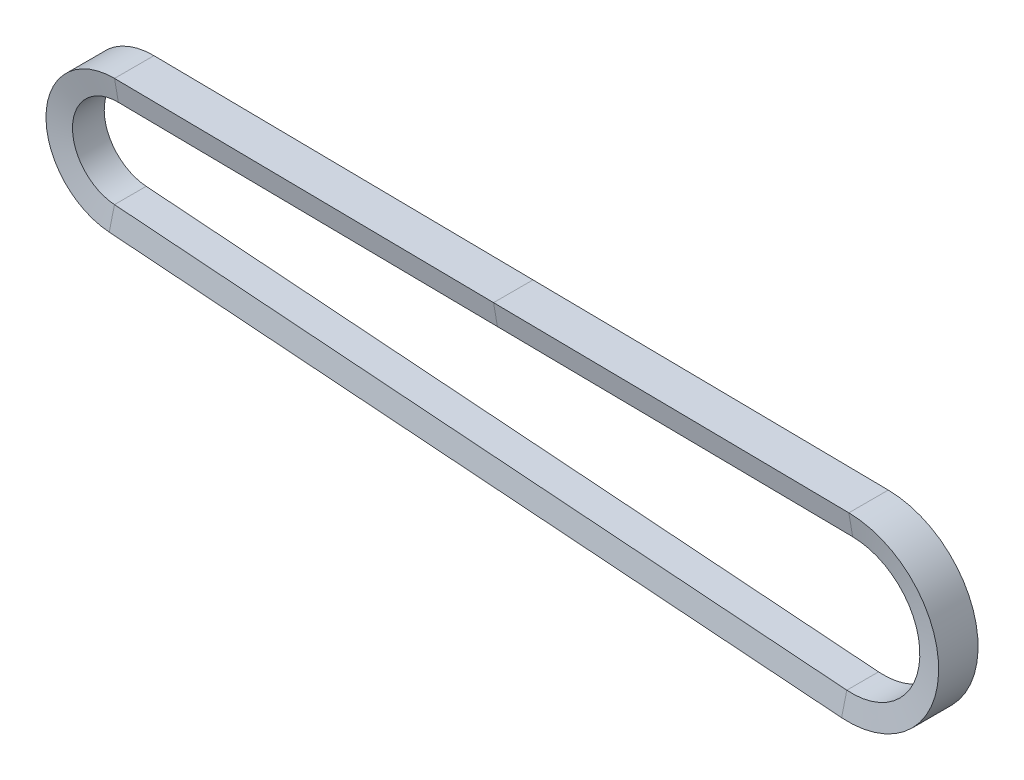
ISO-10303-21;
HEADER;
FILE_DESCRIPTION(('STEP AP214'),'2;1');
FILE_NAME('part.step','',(''),(''),'','','');
FILE_SCHEMA(('AUTOMOTIVE_DESIGN { 1 0 10303 214 1 1 1 1 }'));
ENDSEC;
DATA;
#1=APPLICATION_CONTEXT('core data for automotive mechanical design processes');
#2=APPLICATION_PROTOCOL_DEFINITION('international standard','automotive_design',2000,#1);
#3=PRODUCT_CONTEXT('',#1,'mechanical');
#4=PRODUCT('Part','Part','',(#3));
#5=PRODUCT_RELATED_PRODUCT_CATEGORY('part','',(#4));
#6=PRODUCT_DEFINITION_FORMATION('','',#4);
#7=PRODUCT_DEFINITION_CONTEXT('part definition',#1,'design');
#8=PRODUCT_DEFINITION('design','',#6,#7);
#9=PRODUCT_DEFINITION_SHAPE('','',#8);
#10=(LENGTH_UNIT() NAMED_UNIT(*) SI_UNIT(.MILLI.,.METRE.));
#11=(NAMED_UNIT(*) PLANE_ANGLE_UNIT() SI_UNIT($,.RADIAN.));
#12=(NAMED_UNIT(*) SI_UNIT($,.STERADIAN.) SOLID_ANGLE_UNIT());
#13=UNCERTAINTY_MEASURE_WITH_UNIT(LENGTH_MEASURE(1.E-05),#10,'distance_accuracy_value','');
#14=(GEOMETRIC_REPRESENTATION_CONTEXT(3) GLOBAL_UNCERTAINTY_ASSIGNED_CONTEXT((#13)) GLOBAL_UNIT_ASSIGNED_CONTEXT((#10,
#11,#12)) REPRESENTATION_CONTEXT('',''));
#15=CARTESIAN_POINT('',(0.,0.,0.));
#16=DIRECTION('',(0.,0.,1.));
#17=DIRECTION('',(1.,0.,0.));
#18=AXIS2_PLACEMENT_3D('',#15,#16,#17);
#19=CARTESIAN_POINT('',(78.374582485767,19.1376937923296,4.34770366555069));
#20=DIRECTION('',(0.00206408883546674,0.167155034399031,-0.98592846292839));
#21=DIRECTION('',(0.,0.985930563190832,0.167155390479065));
#22=AXIS2_PLACEMENT_3D('',#19,#20,#21);
#23=PLANE('',#22);
#24=DIRECTION('',(0.,-0.985930563190832,-0.167155390479065));
#25=VECTOR('',#24,1.);
#26=CARTESIAN_POINT('',(78.3745824857669,19.1376937923296,4.34770366555069));
#27=LINE('',#26,#25);
#28=CARTESIAN_POINT('',(78.3745824857669,19.1376937923296,4.34770366555069));
#29=VERTEX_POINT('',#28);
#30=CARTESIAN_POINT('',(78.3745824857669,14.1376937923296,3.5));
#31=VERTEX_POINT('',#30);
#32=EDGE_CURVE('E171',#29,#31,#27,.T.);
#33=ORIENTED_EDGE('',*,*,#32,.F.);
#34=DIRECTION('',(-0.999923767846515,0.0123474084579639,0.));
#35=VECTOR('',#34,1.);
#36=CARTESIAN_POINT('',(78.374582485767,19.1376937923296,4.34770366555069));
#37=LINE('',#36,#35);
#38=CARTESIAN_POINT('',(0.,20.1054905522349,4.34770366555069));
#39=VERTEX_POINT('',#38);
#40=EDGE_CURVE('E170',#29,#39,#37,.T.);
#41=ORIENTED_EDGE('',*,*,#40,.T.);
#42=DIRECTION('',(0.,-0.985930563190832,-0.167155390479065));
#43=VECTOR('',#42,1.);
#44=CARTESIAN_POINT('',(0.,20.1054905522349,4.34770366555069));
#45=LINE('',#44,#43);
#46=CARTESIAN_POINT('',(0.,15.1054905522349,3.5));
#47=VERTEX_POINT('',#46);
#48=EDGE_CURVE('E145',#39,#47,#45,.T.);
#49=ORIENTED_EDGE('',*,*,#48,.T.);
#50=DIRECTION('',(-0.999923767846515,0.0123474084579639,0.));
#51=VECTOR('',#50,1.);
#52=CARTESIAN_POINT('',(78.374582485767,14.1376937923296,3.5));
#53=LINE('',#52,#51);
#54=EDGE_CURVE('E175',#31,#47,#53,.T.);
#55=ORIENTED_EDGE('',*,*,#54,.F.);
#56=EDGE_LOOP('',(#33,#41,#49,#55));
#57=FACE_BOUND('',#56,.T.);
#58=ADVANCED_FACE('F37',(#57),#23,.F.);
#59=CARTESIAN_POINT('',(0.,20.1054905522349,4.34770366555069));
#60=DIRECTION('',(0.00206408883546674,0.167155034399031,-0.98592846292839));
#61=DIRECTION('',(0.,0.985930563190832,0.167155390479065));
#62=AXIS2_PLACEMENT_3D('',#59,#60,#61);
#63=PLANE('',#62);
#64=DIRECTION('',(-0.999923767846515,0.0123474084579639,0.));
#65=VECTOR('',#64,1.);
#66=CARTESIAN_POINT('',(0.,15.1054905522349,3.5));
#67=LINE('',#66,#65);
#68=CARTESIAN_POINT('',(-83.6212463728452,16.138074953097,3.5));
#69=VERTEX_POINT('',#68);
#70=EDGE_CURVE('E151',#47,#69,#67,.T.);
#71=ORIENTED_EDGE('',*,*,#70,.F.);
#72=ORIENTED_EDGE('',*,*,#48,.F.);
#73=DIRECTION('',(-0.999923767846515,0.0123474084579639,0.));
#74=VECTOR('',#73,1.);
#75=CARTESIAN_POINT('',(0.,20.1054905522349,4.34770366555069));
#76=LINE('',#75,#74);
#77=CARTESIAN_POINT('',(-83.6212463728452,21.138074953097,4.34770366555069));
#78=VERTEX_POINT('',#77);
#79=EDGE_CURVE('E149',#39,#78,#76,.T.);
#80=ORIENTED_EDGE('',*,*,#79,.T.);
#81=DIRECTION('',(0.,-0.985930563190832,-0.167155390479065));
#82=VECTOR('',#81,1.);
#83=CARTESIAN_POINT('',(-83.6212463728452,21.138074953097,4.34770366555069));
#84=LINE('',#83,#82);
#85=EDGE_CURVE('E167',#78,#69,#84,.T.);
#86=ORIENTED_EDGE('',*,*,#85,.T.);
#87=EDGE_LOOP('',(#71,#72,#80,#86));
#88=FACE_BOUND('',#87,.T.);
#89=ADVANCED_FACE('F147',(#88),#63,.F.);
#90=CARTESIAN_POINT('',(0.,15.1054905522349,3.5));
#91=DIRECTION('',(0.0123474084579639,0.999923767846515,0.));
#92=DIRECTION('',(-0.999923767846516,0.0123474084579639,0.));
#93=AXIS2_PLACEMENT_3D('',#90,#91,#92);
#94=PLANE('',#93);
#95=DIRECTION('',(-0.999923767846515,0.0123474084579639,0.));
#96=VECTOR('',#95,1.);
#97=CARTESIAN_POINT('',(0.,15.1054905522349,-3.5));
#98=LINE('',#97,#96);
#99=CARTESIAN_POINT('',(0.,15.1054905522349,-3.5));
#100=VERTEX_POINT('',#99);
#101=CARTESIAN_POINT('',(-83.6212463728452,16.138074953097,-3.5));
#102=VERTEX_POINT('',#101);
#103=EDGE_CURVE('E216',#100,#102,#98,.T.);
#104=ORIENTED_EDGE('',*,*,#103,.F.);
#105=DIRECTION('',(0.,0.,-1.));
#106=VECTOR('',#105,1.);
#107=CARTESIAN_POINT('',(0.,15.1054905522349,3.5));
#108=LINE('',#107,#106);
#109=EDGE_CURVE('E156',#47,#100,#108,.T.);
#110=ORIENTED_EDGE('',*,*,#109,.F.);
#111=ORIENTED_EDGE('',*,*,#70,.T.);
#112=DIRECTION('',(0.,0.,-1.));
#113=VECTOR('',#112,1.);
#114=CARTESIAN_POINT('',(-83.6212463728452,16.138074953097,3.5));
#115=LINE('',#114,#113);
#116=EDGE_CURVE('E241',#69,#102,#115,.T.);
#117=ORIENTED_EDGE('',*,*,#116,.T.);
#118=EDGE_LOOP('',(#104,#110,#111,#117));
#119=FACE_BOUND('',#118,.T.);
#120=ADVANCED_FACE('F261',(#119),#94,.F.);
#121=CARTESIAN_POINT('',(0.,15.1054905522349,-3.5));
#122=DIRECTION('',(0.00206408883546674,0.167155034399031,0.98592846292839));
#123=DIRECTION('',(0.,-0.985930563190832,0.167155390479065));
#124=AXIS2_PLACEMENT_3D('',#121,#122,#123);
#125=PLANE('',#124);
#126=DIRECTION('',(-0.999923767846515,0.0123474084579639,0.));
#127=VECTOR('',#126,1.);
#128=CARTESIAN_POINT('',(0.,20.1054905522349,-4.34770366555069));
#129=LINE('',#128,#127);
#130=CARTESIAN_POINT('',(0.,20.1054905522349,-4.34770366555069));
#131=VERTEX_POINT('',#130);
#132=CARTESIAN_POINT('',(-83.6212463728452,21.138074953097,-4.34770366555069));
#133=VERTEX_POINT('',#132);
#134=EDGE_CURVE('E186',#131,#133,#129,.T.);
#135=ORIENTED_EDGE('',*,*,#134,.F.);
#136=DIRECTION('',(0.,0.985930563190832,-0.167155390479065));
#137=VECTOR('',#136,1.);
#138=CARTESIAN_POINT('',(0.,15.1054905522349,-3.5));
#139=LINE('',#138,#137);
#140=EDGE_CURVE('E178',#100,#131,#139,.T.);
#141=ORIENTED_EDGE('',*,*,#140,.F.);
#142=ORIENTED_EDGE('',*,*,#103,.T.);
#143=DIRECTION('',(0.,0.985930563190832,-0.167155390479065));
#144=VECTOR('',#143,1.);
#145=CARTESIAN_POINT('',(-83.6212463728452,16.138074953097,-3.5));
#146=LINE('',#145,#144);
#147=EDGE_CURVE('E218',#102,#133,#146,.T.);
#148=ORIENTED_EDGE('',*,*,#147,.T.);
#149=EDGE_LOOP('',(#135,#141,#142,#148));
#150=FACE_BOUND('',#149,.T.);
#151=ADVANCED_FACE('F214',(#150),#125,.F.);
#152=CARTESIAN_POINT('',(0.,20.1054905522349,4.34770366555069));
#153=DIRECTION('',(-0.0123474084579639,-0.999923767846515,0.));
#154=DIRECTION('',(0.999923767846515,-0.0123474084579639,0.));
#155=AXIS2_PLACEMENT_3D('',#152,#153,#154);
#156=PLANE('',#155);
#157=DIRECTION('',(0.,0.,1.));
#158=VECTOR('',#157,1.);
#159=CARTESIAN_POINT('',(-83.6212463728452,21.138074953097,4.34770366555069));
#160=LINE('',#159,#158);
#161=EDGE_CURVE('E165',#133,#78,#160,.T.);
#162=ORIENTED_EDGE('',*,*,#161,.T.);
#163=ORIENTED_EDGE('',*,*,#79,.F.);
#164=DIRECTION('',(0.,0.,1.));
#165=VECTOR('',#164,1.);
#166=CARTESIAN_POINT('',(0.,20.1054905522349,4.34770366555069));
#167=LINE('',#166,#165);
#168=EDGE_CURVE('E163',#131,#39,#167,.T.);
#169=ORIENTED_EDGE('',*,*,#168,.F.);
#170=ORIENTED_EDGE('',*,*,#134,.T.);
#171=EDGE_LOOP('',(#162,#163,#169,#170));
#172=FACE_BOUND('',#171,.T.);
#173=ADVANCED_FACE('F161',(#172),#156,.F.);
#174=CARTESIAN_POINT('',(-83.6212463728452,21.138074953097,4.34770366555069));
#175=CARTESIAN_POINT('',(-111.863042033429,21.3705620928323,4.34770366555069));
#176=CARTESIAN_POINT('',(-112.966620071375,-6.85062122605928,4.34770366555069));
#177=CARTESIAN_POINT('',(-84.7929106542684,-8.82423975169845,4.34770366555069));
#178=CARTESIAN_POINT('',(-83.6212463728452,16.138074953097,3.5));
#179=CARTESIAN_POINT('',(-102.448631692718,16.3705620928323,3.5));
#180=CARTESIAN_POINT('',(-103.261794457521,-2.44069130961438,3.5));
#181=CARTESIAN_POINT('',(-84.4845779486307,-3.83375571278658,3.5));
#182=(BOUNDED_SURFACE() B_SPLINE_SURFACE(1,3,((#174,#175,#176,#177),(#178,#179,#180,#181)),
.UNSPECIFIED.,.F.,.F.,.F.) B_SPLINE_SURFACE_WITH_KNOTS((2,2),(4,4),(0.,1.),(0.,1.),
.UNSPECIFIED.) GEOMETRIC_REPRESENTATION_ITEM() RATIONAL_B_SPLINE_SURFACE(((1.,0.353898634301636,
0.353898634301636,1.),(1.,0.353898634301636,0.353898634301636,1.))) REPRESENTATION_ITEM('') SURFACE());
#183=CARTESIAN_POINT('',(-83.7447204574248,6.13883727463182,3.5));
#184=DIRECTION('',(0.,0.,1.));
#185=DIRECTION('',(0.0123474084579647,0.999923767846515,0.));
#186=AXIS2_PLACEMENT_3D('',#183,#184,#185);
#187=CIRCLE('',#186,10.);
#188=CARTESIAN_POINT('',(-84.4845779486307,-3.83375571278658,3.5));
#189=VERTEX_POINT('',#188);
#190=EDGE_CURVE('E130',#69,#189,#187,.T.);
#191=CARTESIAN_POINT('',(-83.7447204574248,6.13883727463182,4.34770366555069));
#192=DIRECTION('',(0.,0.,1.));
#193=DIRECTION('',(0.00823174508952548,0.999966118612416,0.));
#194=AXIS2_PLACEMENT_3D('',#191,#192,#193);
#195=CIRCLE('',#194,14.9997458906693);
#196=CARTESIAN_POINT('',(-84.7929106542684,-8.82423975169845,4.34770366555069));
#197=VERTEX_POINT('',#196);
#198=EDGE_CURVE('E185',#78,#197,#195,.T.);
#199=DIRECTION('',(0.0607989276239046,0.984054147815848,-0.167155390479065));
#200=VECTOR('',#199,1.);
#201=CARTESIAN_POINT('',(-84.7929106542684,-8.82423975169845,4.34770366555069));
#202=LINE('',#201,#200);
#203=EDGE_CURVE('E246',#197,#189,#202,.T.);
#204=ORIENTED_EDGE('',*,*,#190,.F.);
#205=ORIENTED_EDGE('',*,*,#85,.F.);
#206=ORIENTED_EDGE('',*,*,#198,.T.);
#207=ORIENTED_EDGE('',*,*,#203,.T.);
#208=EDGE_LOOP('',(#204,#205,#206,#207));
#209=FACE_BOUND('',#208,.T.);
#210=ADVANCED_FACE('F293',(#209),#182,.F.);
#211=CARTESIAN_POINT('',(-83.7447204574248,6.13883727463182,0.));
#212=DIRECTION('',(0.,0.,1.));
#213=DIRECTION('',(1.,0.,0.));
#214=AXIS2_PLACEMENT_3D('',#211,#212,#213);
#215=CYLINDRICAL_SURFACE('',#214,10.);
#216=CARTESIAN_POINT('',(-83.7447204574248,6.13883727463182,-3.5));
#217=DIRECTION('',(0.,0.,1.));
#218=DIRECTION('',(0.0123474084579647,0.999923767846515,0.));
#219=AXIS2_PLACEMENT_3D('',#216,#217,#218);
#220=CIRCLE('',#219,10.);
#221=CARTESIAN_POINT('',(-84.4845779486307,-3.83375571278658,-3.5));
#222=VERTEX_POINT('',#221);
#223=EDGE_CURVE('E124',#102,#222,#220,.T.);
#224=ORIENTED_EDGE('',*,*,#223,.F.);
#225=ORIENTED_EDGE('',*,*,#116,.F.);
#226=ORIENTED_EDGE('',*,*,#190,.T.);
#227=DIRECTION('',(0.,0.,-1.));
#228=VECTOR('',#227,1.);
#229=CARTESIAN_POINT('',(-84.4845779486307,-3.83375571278658,3.5));
#230=LINE('',#229,#228);
#231=EDGE_CURVE('E223',#189,#222,#230,.T.);
#232=ORIENTED_EDGE('',*,*,#231,.T.);
#233=EDGE_LOOP('',(#224,#225,#226,#232));
#234=FACE_BOUND('',#233,.T.);
#235=ADVANCED_FACE('F297',(#234),#215,.F.);
#236=CARTESIAN_POINT('',(-83.6212463728452,16.138074953097,-3.5));
#237=CARTESIAN_POINT('',(-102.448631692718,16.3705620928323,-3.5));
#238=CARTESIAN_POINT('',(-103.261794457521,-2.44069130961438,-3.5));
#239=CARTESIAN_POINT('',(-84.4845779486307,-3.83375571278658,-3.5));
#240=CARTESIAN_POINT('',(-83.6212463728452,21.138074953097,-4.34770366555069));
#241=CARTESIAN_POINT('',(-111.863042033429,21.3705620928323,-4.34770366555069));
#242=CARTESIAN_POINT('',(-112.966620071375,-6.85062122605928,-4.34770366555069));
#243=CARTESIAN_POINT('',(-84.7929106542684,-8.82423975169845,-4.34770366555069));
#244=(BOUNDED_SURFACE() B_SPLINE_SURFACE(1,3,((#236,#237,#238,#239),(#240,#241,#242,#243)),
.UNSPECIFIED.,.F.,.F.,.F.) B_SPLINE_SURFACE_WITH_KNOTS((2,2),(4,4),(0.,1.),(0.,1.),
.UNSPECIFIED.) GEOMETRIC_REPRESENTATION_ITEM() RATIONAL_B_SPLINE_SURFACE(((1.,0.353898634301636,
0.353898634301636,1.),(1.,0.353898634301636,0.353898634301636,1.))) REPRESENTATION_ITEM('') SURFACE());
#245=CARTESIAN_POINT('',(-83.7447204574248,6.13883727463182,-4.34770366555069));
#246=DIRECTION('',(0.,0.,1.));
#247=DIRECTION('',(0.00823174508952548,0.999966118612416,0.));
#248=AXIS2_PLACEMENT_3D('',#245,#246,#247);
#249=CIRCLE('',#248,14.9997458906693);
#250=CARTESIAN_POINT('',(-84.7929106542684,-8.82423975169845,-4.34770366555069));
#251=VERTEX_POINT('',#250);
#252=EDGE_CURVE('E190',#133,#251,#249,.T.);
#253=DIRECTION('',(-0.0607989276239046,-0.984054147815848,-0.167155390479065));
#254=VECTOR('',#253,1.);
#255=CARTESIAN_POINT('',(-84.4845779486307,-3.83375571278658,-3.5));
#256=LINE('',#255,#254);
#257=EDGE_CURVE('E222',#222,#251,#256,.T.);
#258=ORIENTED_EDGE('',*,*,#252,.F.);
#259=ORIENTED_EDGE('',*,*,#147,.F.);
#260=ORIENTED_EDGE('',*,*,#223,.T.);
#261=ORIENTED_EDGE('',*,*,#257,.T.);
#262=EDGE_LOOP('',(#258,#259,#260,#261));
#263=FACE_BOUND('',#262,.T.);
#264=ADVANCED_FACE('F308',(#263),#244,.F.);
#265=CARTESIAN_POINT('',(-83.7447204574248,6.13883727463182,0.));
#266=DIRECTION('',(0.,0.,1.));
#267=DIRECTION('',(1.,0.,0.));
#268=AXIS2_PLACEMENT_3D('',#265,#266,#267);
#269=CYLINDRICAL_SURFACE('',#268,14.9997458906693);
#270=DIRECTION('',(0.,0.,1.));
#271=VECTOR('',#270,1.);
#272=CARTESIAN_POINT('',(-84.7929106542684,-8.82423975169845,4.34770366555069));
#273=LINE('',#272,#271);
#274=EDGE_CURVE('E187',#251,#197,#273,.T.);
#275=ORIENTED_EDGE('',*,*,#274,.T.);
#276=ORIENTED_EDGE('',*,*,#198,.F.);
#277=ORIENTED_EDGE('',*,*,#161,.F.);
#278=ORIENTED_EDGE('',*,*,#252,.T.);
#279=EDGE_LOOP('',(#275,#276,#277,#278));
#280=FACE_BOUND('',#279,.T.);
#281=ADVANCED_FACE('F291',(#280),#269,.T.);
#282=CARTESIAN_POINT('',(-84.7929106542684,-8.82423975169845,4.34770366555069));
#283=DIRECTION('',(-0.0123680332811015,-0.166709621019362,-0.98592846292839));
#284=DIRECTION('',(0.,0.986003879455191,-0.166722373121644));
#285=AXIS2_PLACEMENT_3D('',#282,#283,#284);
#286=PLANE('',#285);
#287=DIRECTION('',(0.997259298741839,-0.0739857491205888,0.));
#288=VECTOR('',#287,1.);
#289=CARTESIAN_POINT('',(-84.4845779486307,-3.83375571278658,3.5));
#290=LINE('',#289,#288);
#291=CARTESIAN_POINT('',(77.0795851220886,-15.8200522064957,3.5));
#292=VERTEX_POINT('',#291);
#293=EDGE_CURVE('E107',#189,#292,#290,.T.);
#294=ORIENTED_EDGE('',*,*,#293,.F.);
#295=ORIENTED_EDGE('',*,*,#203,.F.);
#296=DIRECTION('',(0.997259298741839,-0.0739857491205888,0.));
#297=VECTOR('',#296,1.);
#298=CARTESIAN_POINT('',(-84.7929106542684,-8.82423975169845,4.34770366555069));
#299=LINE('',#298,#297);
#300=CARTESIAN_POINT('',(76.7712524164509,-20.8105362454076,4.34770366555069));
#301=VERTEX_POINT('',#300);
#302=EDGE_CURVE('E189',#197,#301,#299,.T.);
#303=ORIENTED_EDGE('',*,*,#302,.T.);
#304=DIRECTION('',(0.0607989276239043,0.984054147815848,-0.167155390479065));
#305=VECTOR('',#304,1.);
#306=CARTESIAN_POINT('',(76.7712524164509,-20.8105362454076,4.34770366555069));
#307=LINE('',#306,#305);
#308=EDGE_CURVE('E199',#301,#292,#307,.T.);
#309=ORIENTED_EDGE('',*,*,#308,.T.);
#310=EDGE_LOOP('',(#294,#295,#303,#309));
#311=FACE_BOUND('',#310,.T.);
#312=ADVANCED_FACE('F282',(#311),#286,.F.);
#313=CARTESIAN_POINT('',(-84.4845779486307,-3.83375571278658,3.5));
#314=DIRECTION('',(-0.0739857491205888,-0.997259298741839,0.));
#315=DIRECTION('',(0.997259298741839,-0.0739857491205888,0.));
#316=AXIS2_PLACEMENT_3D('',#313,#314,#315);
#317=PLANE('',#316);
#318=DIRECTION('',(0.997259298741839,-0.0739857491205888,0.));
#319=VECTOR('',#318,1.);
#320=CARTESIAN_POINT('',(-84.4845779486307,-3.83375571278658,-3.5));
#321=LINE('',#320,#319);
#322=CARTESIAN_POINT('',(77.0795851220886,-15.8200522064957,-3.5));
#323=VERTEX_POINT('',#322);
#324=EDGE_CURVE('E100',#222,#323,#321,.T.);
#325=ORIENTED_EDGE('',*,*,#324,.F.);
#326=ORIENTED_EDGE('',*,*,#231,.F.);
#327=ORIENTED_EDGE('',*,*,#293,.T.);
#328=DIRECTION('',(0.,0.,-1.));
#329=VECTOR('',#328,1.);
#330=CARTESIAN_POINT('',(77.0795851220886,-15.8200522064957,3.5));
#331=LINE('',#330,#329);
#332=EDGE_CURVE('E197',#292,#323,#331,.T.);
#333=ORIENTED_EDGE('',*,*,#332,.T.);
#334=EDGE_LOOP('',(#325,#326,#327,#333));
#335=FACE_BOUND('',#334,.T.);
#336=ADVANCED_FACE('F290',(#335),#317,.F.);
#337=CARTESIAN_POINT('',(-84.4845779486307,-3.83375571278658,-3.5));
#338=DIRECTION('',(-0.0123680332811015,-0.166709621019362,0.98592846292839));
#339=DIRECTION('',(0.,-0.986003879455191,-0.166722373121644));
#340=AXIS2_PLACEMENT_3D('',#337,#338,#339);
#341=PLANE('',#340);
#342=DIRECTION('',(0.997259298741839,-0.0739857491205888,0.));
#343=VECTOR('',#342,1.);
#344=CARTESIAN_POINT('',(-84.7929106542684,-8.82423975169845,-4.34770366555069));
#345=LINE('',#344,#343);
#346=CARTESIAN_POINT('',(76.7712524164509,-20.8105362454076,-4.34770366555069));
#347=VERTEX_POINT('',#346);
#348=EDGE_CURVE('E91',#251,#347,#345,.T.);
#349=ORIENTED_EDGE('',*,*,#348,.F.);
#350=ORIENTED_EDGE('',*,*,#257,.F.);
#351=ORIENTED_EDGE('',*,*,#324,.T.);
#352=DIRECTION('',(-0.0607989276239043,-0.984054147815848,-0.167155390479065));
#353=VECTOR('',#352,1.);
#354=CARTESIAN_POINT('',(77.0795851220886,-15.8200522064957,-3.5));
#355=LINE('',#354,#353);
#356=EDGE_CURVE('E193',#323,#347,#355,.T.);
#357=ORIENTED_EDGE('',*,*,#356,.T.);
#358=EDGE_LOOP('',(#349,#350,#351,#357));
#359=FACE_BOUND('',#358,.T.);
#360=ADVANCED_FACE('F312',(#359),#341,.F.);
#361=CARTESIAN_POINT('',(-84.7929106542684,-8.82423975169845,4.34770366555069));
#362=DIRECTION('',(0.0739857491205888,0.997259298741839,0.));
#363=DIRECTION('',(-0.997259298741839,0.0739857491205888,0.));
#364=AXIS2_PLACEMENT_3D('',#361,#362,#363);
#365=PLANE('',#364);
#366=DIRECTION('',(0.,0.,1.));
#367=VECTOR('',#366,1.);
#368=CARTESIAN_POINT('',(76.7712524164509,-20.8105362454076,4.34770366555069));
#369=LINE('',#368,#367);
#370=EDGE_CURVE('E191',#347,#301,#369,.T.);
#371=ORIENTED_EDGE('',*,*,#370,.T.);
#372=ORIENTED_EDGE('',*,*,#302,.F.);
#373=ORIENTED_EDGE('',*,*,#274,.F.);
#374=ORIENTED_EDGE('',*,*,#348,.T.);
#375=EDGE_LOOP('',(#371,#372,#373,#374));
#376=FACE_BOUND('',#375,.T.);
#377=ADVANCED_FACE('F281',(#376),#365,.F.);
#378=CARTESIAN_POINT('',(76.7712524164509,-20.8105362454076,4.34770366555069));
#379=CARTESIAN_POINT('',(88.7452358073801,-21.6617174940899,4.34770366555069));
#380=CARTESIAN_POINT('',(97.6915935073657,-13.6577514978937,4.34770366555069));
#381=CARTESIAN_POINT('',(98.1729968109374,-1.66320946313191,4.34770366555069));
#382=CARTESIAN_POINT('',(98.6544001145091,10.3313325716299,4.34770366555069));
#383=CARTESIAN_POINT('',(90.3782664881714,19.0265266444128,4.34770366555069));
#384=CARTESIAN_POINT('',(78.3745824857669,19.1376937923296,4.34770366555069));
#385=CARTESIAN_POINT('',(77.0795851220886,-15.8200522064957,3.5));
#386=CARTESIAN_POINT('',(86.0581875836567,-16.486166455832,3.5));
#387=CARTESIAN_POINT('',(92.7865506222458,-10.5038474090917,3.5));
#388=CARTESIAN_POINT('',(93.1753763674384,-1.50896970586964,3.5));
#389=CARTESIAN_POINT('',(93.5642021126309,7.48590799735238,3.5));
#390=CARTESIAN_POINT('',(87.3771739027573,14.0265266444128,3.5));
#391=CARTESIAN_POINT('',(78.3745824857669,14.1376937923296,3.5));
#392=(BOUNDED_SURFACE() B_SPLINE_SURFACE(1,3,((#378,#379,#380,#381,#382,#383,#384),(#385,#386,
#387,#388,#389,#390,#391)),.UNSPECIFIED.,.F.,.F.,.F.) B_SPLINE_SURFACE_WITH_KNOTS((2,2),(4,3,4),
(0.,1.),(0.,0.5,1.),
.UNSPECIFIED.) GEOMETRIC_REPRESENTATION_ITEM() RATIONAL_B_SPLINE_SURFACE(((1.,0.797409966982836,
0.797409966982836,1.,0.797409966982836,0.797409966982836,1.),(1.,0.797409966982836,
0.797409966982836,1.,0.797409966982836,0.797409966982836,1.))) REPRESENTATION_ITEM('') SURFACE());
#393=CARTESIAN_POINT('',(78.1893713588974,-0.861162725368124,3.5));
#394=DIRECTION('',(0.,0.,1.));
#395=DIRECTION('',(-0.0739857491205883,-0.997259298741839,0.));
#396=AXIS2_PLACEMENT_3D('',#393,#394,#395);
#397=CIRCLE('',#396,15.);
#398=EDGE_CURVE('E231',#292,#31,#397,.T.);
#399=CARTESIAN_POINT('',(78.1893713588974,-0.861162725368124,4.34770366555069));
#400=DIRECTION('',(0.,0.,1.));
#401=DIRECTION('',(-0.0709069606402519,-0.997482933654888,0.));
#402=AXIS2_PLACEMENT_3D('',#399,#400,#401);
#403=CIRCLE('',#402,19.9997141273814);
#404=EDGE_CURVE('E192',#301,#29,#403,.T.);
#405=ORIENTED_EDGE('',*,*,#398,.F.);
#406=ORIENTED_EDGE('',*,*,#308,.F.);
#407=ORIENTED_EDGE('',*,*,#404,.T.);
#408=ORIENTED_EDGE('',*,*,#32,.T.);
#409=EDGE_LOOP('',(#405,#406,#407,#408));
#410=FACE_BOUND('',#409,.T.);
#411=ADVANCED_FACE('F276',(#410),#392,.F.);
#412=CARTESIAN_POINT('',(78.1893713588974,-0.861162725368124,0.));
#413=DIRECTION('',(0.,0.,1.));
#414=DIRECTION('',(1.,0.,0.));
#415=AXIS2_PLACEMENT_3D('',#412,#413,#414);
#416=CYLINDRICAL_SURFACE('',#415,15.);
#417=CARTESIAN_POINT('',(78.1893713588974,-0.861162725368124,-3.5));
#418=DIRECTION('',(0.,0.,1.));
#419=DIRECTION('',(-0.0739857491205883,-0.997259298741839,0.));
#420=AXIS2_PLACEMENT_3D('',#417,#418,#419);
#421=CIRCLE('',#420,15.);
#422=CARTESIAN_POINT('',(78.3745824857669,14.1376937923296,-3.5));
#423=VERTEX_POINT('',#422);
#424=EDGE_CURVE('E62',#323,#423,#421,.T.);
#425=ORIENTED_EDGE('',*,*,#424,.F.);
#426=ORIENTED_EDGE('',*,*,#332,.F.);
#427=ORIENTED_EDGE('',*,*,#398,.T.);
#428=DIRECTION('',(0.,0.,-1.));
#429=VECTOR('',#428,1.);
#430=CARTESIAN_POINT('',(78.3745824857669,14.1376937923296,3.5));
#431=LINE('',#430,#429);
#432=EDGE_CURVE('E229',#31,#423,#431,.T.);
#433=ORIENTED_EDGE('',*,*,#432,.T.);
#434=EDGE_LOOP('',(#425,#426,#427,#433));
#435=FACE_BOUND('',#434,.T.);
#436=ADVANCED_FACE('F257',(#435),#416,.F.);
#437=CARTESIAN_POINT('',(77.0795851220886,-15.8200522064957,-3.5));
#438=CARTESIAN_POINT('',(86.0581875836567,-16.486166455832,-3.5));
#439=CARTESIAN_POINT('',(92.7865506222458,-10.5038474090917,-3.5));
#440=CARTESIAN_POINT('',(93.1753763674384,-1.50896970586964,-3.5));
#441=CARTESIAN_POINT('',(93.5642021126309,7.48590799735238,-3.5));
#442=CARTESIAN_POINT('',(87.3771739027573,14.0265266444128,-3.5));
#443=CARTESIAN_POINT('',(78.3745824857669,14.1376937923296,-3.5));
#444=CARTESIAN_POINT('',(76.7712524164509,-20.8105362454076,-4.34770366555069));
#445=CARTESIAN_POINT('',(88.7452358073801,-21.6617174940899,-4.34770366555069));
#446=CARTESIAN_POINT('',(97.6915935073657,-13.6577514978937,-4.34770366555069));
#447=CARTESIAN_POINT('',(98.1729968109374,-1.66320946313191,-4.34770366555069));
#448=CARTESIAN_POINT('',(98.6544001145091,10.3313325716299,-4.34770366555069));
#449=CARTESIAN_POINT('',(90.3782664881714,19.0265266444128,-4.34770366555069));
#450=CARTESIAN_POINT('',(78.3745824857669,19.1376937923296,-4.34770366555069));
#451=(BOUNDED_SURFACE() B_SPLINE_SURFACE(1,3,((#437,#438,#439,#440,#441,#442,#443),(#444,#445,
#446,#447,#448,#449,#450)),.UNSPECIFIED.,.F.,.F.,.F.) B_SPLINE_SURFACE_WITH_KNOTS((2,2),(4,3,4),
(0.,1.),(0.,0.5,1.),
.UNSPECIFIED.) GEOMETRIC_REPRESENTATION_ITEM() RATIONAL_B_SPLINE_SURFACE(((1.,0.797409966982836,
0.797409966982836,1.,0.797409966982836,0.797409966982836,1.),(1.,0.797409966982836,
0.797409966982836,1.,0.797409966982836,0.797409966982836,1.))) REPRESENTATION_ITEM('') SURFACE());
#452=CARTESIAN_POINT('',(78.1893713588974,-0.861162725368124,-4.34770366555069));
#453=DIRECTION('',(0.,0.,1.));
#454=DIRECTION('',(-0.0709069606402519,-0.997482933654888,0.));
#455=AXIS2_PLACEMENT_3D('',#452,#453,#454);
#456=CIRCLE('',#455,19.9997141273814);
#457=CARTESIAN_POINT('',(78.3745824857669,19.1376937923296,-4.34770366555069));
#458=VERTEX_POINT('',#457);
#459=EDGE_CURVE('E54',#347,#458,#456,.T.);
#460=DIRECTION('',(0.,0.985930563190832,-0.167155390479065));
#461=VECTOR('',#460,1.);
#462=CARTESIAN_POINT('',(78.3745824857669,14.1376937923296,-3.5));
#463=LINE('',#462,#461);
#464=EDGE_CURVE('E205',#423,#458,#463,.T.);
#465=ORIENTED_EDGE('',*,*,#459,.F.);
#466=ORIENTED_EDGE('',*,*,#356,.F.);
#467=ORIENTED_EDGE('',*,*,#424,.T.);
#468=ORIENTED_EDGE('',*,*,#464,.T.);
#469=EDGE_LOOP('',(#465,#466,#467,#468));
#470=FACE_BOUND('',#469,.T.);
#471=ADVANCED_FACE('F321',(#470),#451,.F.);
#472=CARTESIAN_POINT('',(78.1893713588974,-0.861162725368124,0.));
#473=DIRECTION('',(0.,0.,1.));
#474=DIRECTION('',(1.,0.,0.));
#475=AXIS2_PLACEMENT_3D('',#472,#473,#474);
#476=CYLINDRICAL_SURFACE('',#475,19.9997141273814);
#477=DIRECTION('',(0.,0.,1.));
#478=VECTOR('',#477,1.);
#479=CARTESIAN_POINT('',(78.3745824857669,19.1376937923296,4.34770366555069));
#480=LINE('',#479,#478);
#481=EDGE_CURVE('E41',#458,#29,#480,.T.);
#482=ORIENTED_EDGE('',*,*,#481,.T.);
#483=ORIENTED_EDGE('',*,*,#404,.F.);
#484=ORIENTED_EDGE('',*,*,#370,.F.);
#485=ORIENTED_EDGE('',*,*,#459,.T.);
#486=EDGE_LOOP('',(#482,#483,#484,#485));
#487=FACE_BOUND('',#486,.T.);
#488=ADVANCED_FACE('F206',(#487),#476,.T.);
#489=CARTESIAN_POINT('',(78.374582485767,14.1376937923296,3.5));
#490=DIRECTION('',(0.0123474084579639,0.999923767846515,0.));
#491=DIRECTION('',(-0.999923767846515,0.0123474084579639,0.));
#492=AXIS2_PLACEMENT_3D('',#489,#490,#491);
#493=PLANE('',#492);
#494=ORIENTED_EDGE('',*,*,#54,.T.);
#495=ORIENTED_EDGE('',*,*,#109,.T.);
#496=DIRECTION('',(-0.999923767846515,0.0123474084579639,0.));
#497=VECTOR('',#496,1.);
#498=CARTESIAN_POINT('',(78.374582485767,14.1376937923296,-3.5));
#499=LINE('',#498,#497);
#500=EDGE_CURVE('E46',#423,#100,#499,.T.);
#501=ORIENTED_EDGE('',*,*,#500,.F.);
#502=ORIENTED_EDGE('',*,*,#432,.F.);
#503=EDGE_LOOP('',(#494,#495,#501,#502));
#504=FACE_BOUND('',#503,.T.);
#505=ADVANCED_FACE('F260',(#504),#493,.F.);
#506=CARTESIAN_POINT('',(78.374582485767,14.1376937923296,-3.5));
#507=DIRECTION('',(0.00206408883546674,0.167155034399031,0.98592846292839));
#508=DIRECTION('',(0.,-0.985930563190832,0.167155390479065));
#509=AXIS2_PLACEMENT_3D('',#506,#507,#508);
#510=PLANE('',#509);
#511=ORIENTED_EDGE('',*,*,#500,.T.);
#512=ORIENTED_EDGE('',*,*,#140,.T.);
#513=DIRECTION('',(-0.999923767846515,0.0123474084579639,0.));
#514=VECTOR('',#513,1.);
#515=CARTESIAN_POINT('',(78.374582485767,19.1376937923296,-4.34770366555069));
#516=LINE('',#515,#514);
#517=EDGE_CURVE('E11',#458,#131,#516,.T.);
#518=ORIENTED_EDGE('',*,*,#517,.F.);
#519=ORIENTED_EDGE('',*,*,#464,.F.);
#520=EDGE_LOOP('',(#511,#512,#518,#519));
#521=FACE_BOUND('',#520,.T.);
#522=ADVANCED_FACE('F210',(#521),#510,.F.);
#523=CARTESIAN_POINT('',(78.374582485767,19.1376937923296,4.34770366555069));
#524=DIRECTION('',(-0.0123474084579639,-0.999923767846515,0.));
#525=DIRECTION('',(0.999923767846515,-0.0123474084579639,0.));
#526=AXIS2_PLACEMENT_3D('',#523,#524,#525);
#527=PLANE('',#526);
#528=ORIENTED_EDGE('',*,*,#517,.T.);
#529=ORIENTED_EDGE('',*,*,#168,.T.);
#530=ORIENTED_EDGE('',*,*,#40,.F.);
#531=ORIENTED_EDGE('',*,*,#481,.F.);
#532=EDGE_LOOP('',(#528,#529,#530,#531));
#533=FACE_BOUND('',#532,.T.);
#534=ADVANCED_FACE('F39',(#533),#527,.F.);
#535=CLOSED_SHELL('',(#58,#89,#120,#151,#173,#210,#235,#264,#281,#312,#336,#360,#377,#411,#436,
#471,#488,#505,#522,#534));
#536=MANIFOLD_SOLID_BREP('B2',#535);
#537=ADVANCED_BREP_SHAPE_REPRESENTATION('',(#18,#536),#14);
#538=SHAPE_DEFINITION_REPRESENTATION(#9,#537);
ENDSEC;
END-ISO-10303-21;
